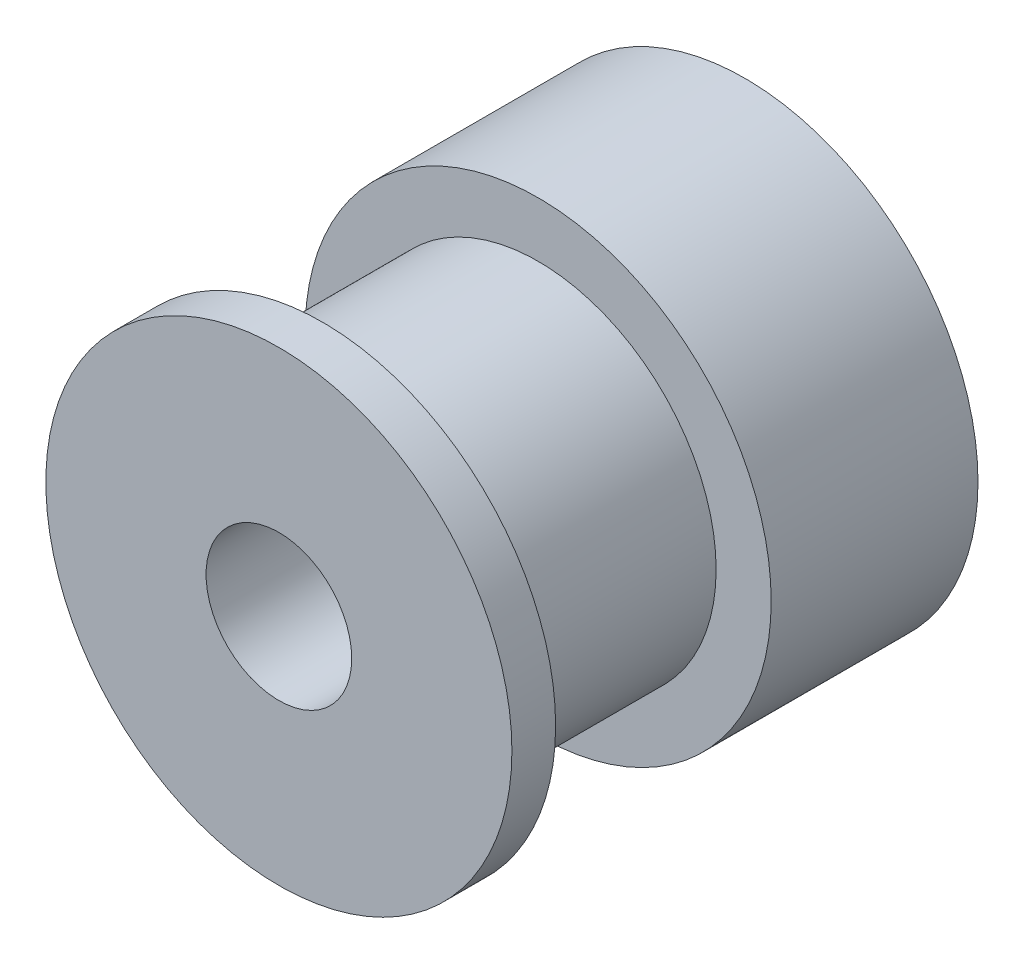
ISO-10303-21;
HEADER;
FILE_DESCRIPTION(('STEP AP214'),'2;1');
FILE_NAME('part.step','',(''),(''),'','','');
FILE_SCHEMA(('AUTOMOTIVE_DESIGN { 1 0 10303 214 1 1 1 1 }'));
ENDSEC;
DATA;
#1=APPLICATION_CONTEXT('core data for automotive mechanical design processes');
#2=APPLICATION_PROTOCOL_DEFINITION('international standard','automotive_design',2000,#1);
#3=PRODUCT_CONTEXT('',#1,'mechanical');
#4=PRODUCT('Part','Part','',(#3));
#5=PRODUCT_RELATED_PRODUCT_CATEGORY('part','',(#4));
#6=PRODUCT_DEFINITION_FORMATION('','',#4);
#7=PRODUCT_DEFINITION_CONTEXT('part definition',#1,'design');
#8=PRODUCT_DEFINITION('design','',#6,#7);
#9=PRODUCT_DEFINITION_SHAPE('','',#8);
#10=(LENGTH_UNIT() NAMED_UNIT(*) SI_UNIT(.MILLI.,.METRE.));
#11=(NAMED_UNIT(*) PLANE_ANGLE_UNIT() SI_UNIT($,.RADIAN.));
#12=(NAMED_UNIT(*) SI_UNIT($,.STERADIAN.) SOLID_ANGLE_UNIT());
#13=UNCERTAINTY_MEASURE_WITH_UNIT(LENGTH_MEASURE(1.E-05),#10,'distance_accuracy_value','');
#14=(GEOMETRIC_REPRESENTATION_CONTEXT(3) GLOBAL_UNCERTAINTY_ASSIGNED_CONTEXT((#13)) GLOBAL_UNIT_ASSIGNED_CONTEXT((#10,
#11,#12)) REPRESENTATION_CONTEXT('',''));
#15=CARTESIAN_POINT('',(0.,0.,0.));
#16=DIRECTION('',(0.,0.,1.));
#17=DIRECTION('',(1.,0.,0.));
#18=AXIS2_PLACEMENT_3D('',#15,#16,#17);
#19=CARTESIAN_POINT('',(0.,0.,7.1));
#20=DIRECTION('',(0.,0.,-1.));
#21=DIRECTION('',(-1.,0.,0.));
#22=AXIS2_PLACEMENT_3D('',#19,#20,#21);
#23=CYLINDRICAL_SURFACE('',#22,8.);
#24=CARTESIAN_POINT('',(0.,0.,7.1));
#25=DIRECTION('',(0.,0.,1.));
#26=DIRECTION('',(1.,0.,0.));
#27=AXIS2_PLACEMENT_3D('',#24,#25,#26);
#28=CIRCLE('',#27,8.);
#29=CARTESIAN_POINT('',(8.,0.,7.1));
#30=VERTEX_POINT('',#29);
#31=EDGE_CURVE('E38',#30,#30,#28,.T.);
#32=ORIENTED_EDGE('',*,*,#31,.F.);
#33=EDGE_LOOP('',(#32));
#34=FACE_BOUND('',#33,.T.);
#35=CARTESIAN_POINT('',(0.,0.,0.));
#36=DIRECTION('',(0.,0.,1.));
#37=DIRECTION('',(1.,0.,0.));
#38=AXIS2_PLACEMENT_3D('',#35,#36,#37);
#39=CIRCLE('',#38,8.);
#40=CARTESIAN_POINT('',(8.,0.,0.));
#41=VERTEX_POINT('',#40);
#42=EDGE_CURVE('E34',#41,#41,#39,.T.);
#43=ORIENTED_EDGE('',*,*,#42,.T.);
#44=EDGE_LOOP('',(#43));
#45=FACE_BOUND('',#44,.T.);
#46=ADVANCED_FACE('F31',(#34,#45),#23,.T.);
#47=CARTESIAN_POINT('',(0.,0.,7.1));
#48=DIRECTION('',(0.,0.,1.));
#49=DIRECTION('',(1.,0.,0.));
#50=AXIS2_PLACEMENT_3D('',#47,#48,#49);
#51=PLANE('',#50);
#52=CARTESIAN_POINT('',(0.,0.,7.1));
#53=DIRECTION('',(0.,0.,1.));
#54=DIRECTION('',(1.,0.,0.));
#55=AXIS2_PLACEMENT_3D('',#52,#53,#54);
#56=CIRCLE('',#55,6.11);
#57=CARTESIAN_POINT('',(6.11,0.,7.1));
#58=VERTEX_POINT('',#57);
#59=EDGE_CURVE('E10',#58,#58,#56,.T.);
#60=ORIENTED_EDGE('',*,*,#59,.F.);
#61=EDGE_LOOP('',(#60));
#62=FACE_BOUND('',#61,.T.);
#63=ORIENTED_EDGE('',*,*,#31,.T.);
#64=EDGE_LOOP('',(#63));
#65=FACE_BOUND('',#64,.T.);
#66=ADVANCED_FACE('F89',(#62,#65),#51,.T.);
#67=CARTESIAN_POINT('',(0.,0.,0.));
#68=DIRECTION('',(0.,0.,1.));
#69=DIRECTION('',(1.,0.,0.));
#70=AXIS2_PLACEMENT_3D('',#67,#68,#69);
#71=PLANE('',#70);
#72=CARTESIAN_POINT('',(0.,0.,0.));
#73=DIRECTION('',(0.,0.,1.));
#74=DIRECTION('',(1.,0.,0.));
#75=AXIS2_PLACEMENT_3D('',#72,#73,#74);
#76=CIRCLE('',#75,2.5);
#77=CARTESIAN_POINT('',(2.5,0.,0.));
#78=VERTEX_POINT('',#77);
#79=EDGE_CURVE('E51',#78,#78,#76,.T.);
#80=ORIENTED_EDGE('',*,*,#79,.T.);
#81=EDGE_LOOP('',(#80));
#82=FACE_BOUND('',#81,.T.);
#83=ORIENTED_EDGE('',*,*,#42,.F.);
#84=EDGE_LOOP('',(#83));
#85=FACE_BOUND('',#84,.T.);
#86=ADVANCED_FACE('F60',(#82,#85),#71,.F.);
#87=CARTESIAN_POINT('',(0.,0.,14.5));
#88=DIRECTION('',(0.,0.,-1.));
#89=DIRECTION('',(-1.,0.,0.));
#90=AXIS2_PLACEMENT_3D('',#87,#88,#89);
#91=CYLINDRICAL_SURFACE('',#90,6.11);
#92=CARTESIAN_POINT('',(0.,0.,14.5));
#93=DIRECTION('',(0.,0.,1.));
#94=DIRECTION('',(1.,0.,0.));
#95=AXIS2_PLACEMENT_3D('',#92,#93,#94);
#96=CIRCLE('',#95,6.11);
#97=CARTESIAN_POINT('',(6.11,0.,14.5));
#98=VERTEX_POINT('',#97);
#99=EDGE_CURVE('E44',#98,#98,#96,.T.);
#100=ORIENTED_EDGE('',*,*,#99,.F.);
#101=EDGE_LOOP('',(#100));
#102=FACE_BOUND('',#101,.T.);
#103=ORIENTED_EDGE('',*,*,#59,.T.);
#104=EDGE_LOOP('',(#103));
#105=FACE_BOUND('',#104,.T.);
#106=ADVANCED_FACE('F79',(#102,#105),#91,.T.);
#107=CARTESIAN_POINT('',(0.,0.,16.));
#108=DIRECTION('',(0.,0.,-1.));
#109=DIRECTION('',(-1.,0.,0.));
#110=AXIS2_PLACEMENT_3D('',#107,#108,#109);
#111=CYLINDRICAL_SURFACE('',#110,8.);
#112=CARTESIAN_POINT('',(0.,0.,16.));
#113=DIRECTION('',(0.,0.,1.));
#114=DIRECTION('',(1.,0.,0.));
#115=AXIS2_PLACEMENT_3D('',#112,#113,#114);
#116=CIRCLE('',#115,8.);
#117=CARTESIAN_POINT('',(8.,0.,16.));
#118=VERTEX_POINT('',#117);
#119=EDGE_CURVE('E47',#118,#118,#116,.T.);
#120=ORIENTED_EDGE('',*,*,#119,.F.);
#121=EDGE_LOOP('',(#120));
#122=FACE_BOUND('',#121,.T.);
#123=CARTESIAN_POINT('',(0.,0.,14.5));
#124=DIRECTION('',(0.,0.,1.));
#125=DIRECTION('',(1.,0.,0.));
#126=AXIS2_PLACEMENT_3D('',#123,#124,#125);
#127=CIRCLE('',#126,8.);
#128=CARTESIAN_POINT('',(8.,0.,14.5));
#129=VERTEX_POINT('',#128);
#130=EDGE_CURVE('E48',#129,#129,#127,.T.);
#131=ORIENTED_EDGE('',*,*,#130,.T.);
#132=EDGE_LOOP('',(#131));
#133=FACE_BOUND('',#132,.T.);
#134=ADVANCED_FACE('F73',(#122,#133),#111,.T.);
#135=CARTESIAN_POINT('',(0.,0.,16.));
#136=DIRECTION('',(0.,0.,1.));
#137=DIRECTION('',(1.,0.,0.));
#138=AXIS2_PLACEMENT_3D('',#135,#136,#137);
#139=PLANE('',#138);
#140=CARTESIAN_POINT('',(0.,0.,16.));
#141=DIRECTION('',(0.,0.,1.));
#142=DIRECTION('',(1.,0.,0.));
#143=AXIS2_PLACEMENT_3D('',#140,#141,#142);
#144=CIRCLE('',#143,2.5);
#145=CARTESIAN_POINT('',(2.5,0.,16.));
#146=VERTEX_POINT('',#145);
#147=EDGE_CURVE('E54',#146,#146,#144,.T.);
#148=ORIENTED_EDGE('',*,*,#147,.F.);
#149=EDGE_LOOP('',(#148));
#150=FACE_BOUND('',#149,.T.);
#151=ORIENTED_EDGE('',*,*,#119,.T.);
#152=EDGE_LOOP('',(#151));
#153=FACE_BOUND('',#152,.T.);
#154=ADVANCED_FACE('F70',(#150,#153),#139,.T.);
#155=CARTESIAN_POINT('',(0.,0.,14.5));
#156=DIRECTION('',(0.,0.,1.));
#157=DIRECTION('',(1.,0.,0.));
#158=AXIS2_PLACEMENT_3D('',#155,#156,#157);
#159=PLANE('',#158);
#160=ORIENTED_EDGE('',*,*,#99,.T.);
#161=EDGE_LOOP('',(#160));
#162=FACE_BOUND('',#161,.T.);
#163=ORIENTED_EDGE('',*,*,#130,.F.);
#164=EDGE_LOOP('',(#163));
#165=FACE_BOUND('',#164,.T.);
#166=ADVANCED_FACE('F66',(#162,#165),#159,.F.);
#167=CARTESIAN_POINT('',(0.,0.,0.));
#168=DIRECTION('',(0.,0.,1.));
#169=DIRECTION('',(1.,0.,0.));
#170=AXIS2_PLACEMENT_3D('',#167,#168,#169);
#171=CYLINDRICAL_SURFACE('',#170,2.5);
#172=ORIENTED_EDGE('',*,*,#79,.F.);
#173=EDGE_LOOP('',(#172));
#174=FACE_BOUND('',#173,.T.);
#175=ORIENTED_EDGE('',*,*,#147,.T.);
#176=EDGE_LOOP('',(#175));
#177=FACE_BOUND('',#176,.T.);
#178=ADVANCED_FACE('F63',(#174,#177),#171,.F.);
#179=CLOSED_SHELL('',(#46,#66,#86,#106,#134,#154,#166,#178));
#180=MANIFOLD_SOLID_BREP('B2',#179);
#181=ADVANCED_BREP_SHAPE_REPRESENTATION('',(#18,#180),#14);
#182=SHAPE_DEFINITION_REPRESENTATION(#9,#181);
ENDSEC;
END-ISO-10303-21;
